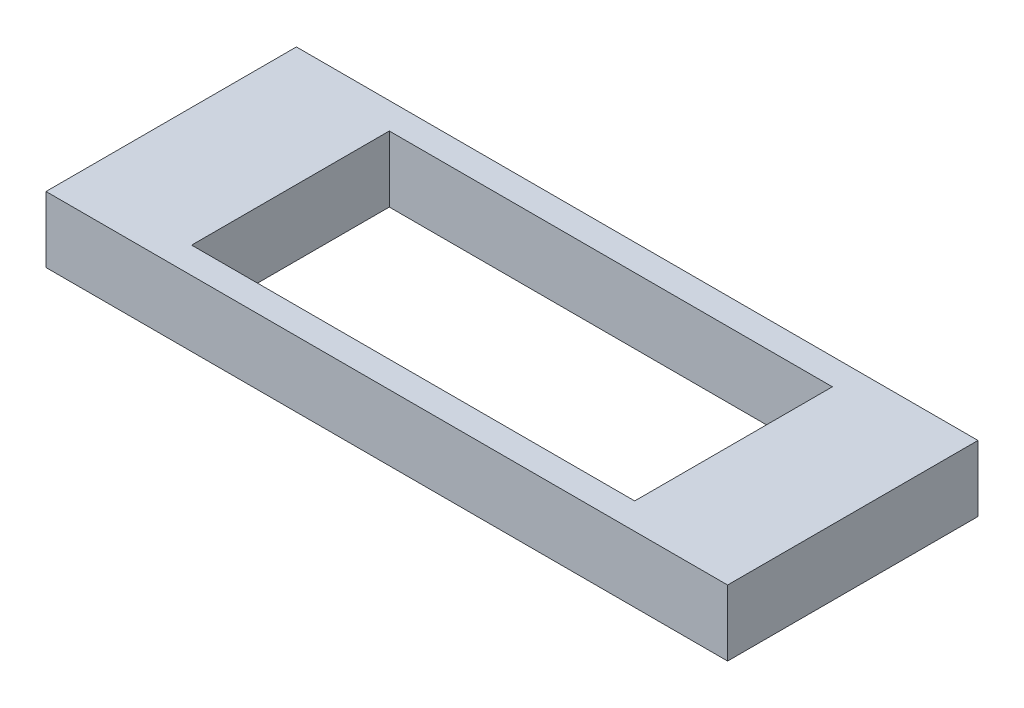
ISO-10303-21;
HEADER;
FILE_DESCRIPTION(('STEP AP214'),'2;1');
FILE_NAME('part.step','',(''),(''),'','','');
FILE_SCHEMA(('AUTOMOTIVE_DESIGN { 1 0 10303 214 1 1 1 1 }'));
ENDSEC;
DATA;
#1=APPLICATION_CONTEXT('core data for automotive mechanical design processes');
#2=APPLICATION_PROTOCOL_DEFINITION('international standard','automotive_design',2000,#1);
#3=PRODUCT_CONTEXT('',#1,'mechanical');
#4=PRODUCT('Part','Part','',(#3));
#5=PRODUCT_RELATED_PRODUCT_CATEGORY('part','',(#4));
#6=PRODUCT_DEFINITION_FORMATION('','',#4);
#7=PRODUCT_DEFINITION_CONTEXT('part definition',#1,'design');
#8=PRODUCT_DEFINITION('design','',#6,#7);
#9=PRODUCT_DEFINITION_SHAPE('','',#8);
#10=(LENGTH_UNIT() NAMED_UNIT(*) SI_UNIT(.MILLI.,.METRE.));
#11=(NAMED_UNIT(*) PLANE_ANGLE_UNIT() SI_UNIT($,.RADIAN.));
#12=(NAMED_UNIT(*) SI_UNIT($,.STERADIAN.) SOLID_ANGLE_UNIT());
#13=UNCERTAINTY_MEASURE_WITH_UNIT(LENGTH_MEASURE(1.E-05),#10,'distance_accuracy_value','');
#14=(GEOMETRIC_REPRESENTATION_CONTEXT(3) GLOBAL_UNCERTAINTY_ASSIGNED_CONTEXT((#13)) GLOBAL_UNIT_ASSIGNED_CONTEXT((#10,
#11,#12)) REPRESENTATION_CONTEXT('',''));
#15=CARTESIAN_POINT('',(0.,0.,0.));
#16=DIRECTION('',(0.,0.,1.));
#17=DIRECTION('',(1.,0.,0.));
#18=AXIS2_PLACEMENT_3D('',#15,#16,#17);
#19=CARTESIAN_POINT('',(-33.6217528353462,114.867131673616,5.));
#20=DIRECTION('',(-1.,0.,0.));
#21=DIRECTION('',(0.,0.,1.));
#22=AXIS2_PLACEMENT_3D('',#19,#20,#21);
#23=PLANE('',#22);
#24=DIRECTION('',(-6.86187218157383E-12,1.,0.));
#25=VECTOR('',#24,1.);
#26=CARTESIAN_POINT('',(-33.6217528354149,124.867131673616,35.));
#27=LINE('',#26,#25);
#28=CARTESIAN_POINT('',(-33.6217528353462,114.867131673616,35.));
#29=VERTEX_POINT('',#28);
#30=CARTESIAN_POINT('',(-33.6217528353462,124.867131673616,35.));
#31=VERTEX_POINT('',#30);
#32=EDGE_CURVE('E137',#29,#31,#27,.T.);
#33=ORIENTED_EDGE('',*,*,#32,.F.);
#34=DIRECTION('',(0.,0.,1.));
#35=VECTOR('',#34,1.);
#36=CARTESIAN_POINT('',(-33.6217528353462,114.867131673616,5.));
#37=LINE('',#36,#35);
#38=CARTESIAN_POINT('',(-33.6217528353462,114.867131673616,5.));
#39=VERTEX_POINT('',#38);
#40=EDGE_CURVE('E144',#39,#29,#37,.T.);
#41=ORIENTED_EDGE('',*,*,#40,.F.);
#42=DIRECTION('',(0.,1.,0.));
#43=VECTOR('',#42,1.);
#44=CARTESIAN_POINT('',(-33.6217528353462,114.867131673616,5.));
#45=LINE('',#44,#43);
#46=CARTESIAN_POINT('',(-33.6217528353462,124.867131673616,5.));
#47=VERTEX_POINT('',#46);
#48=EDGE_CURVE('E159',#39,#47,#45,.T.);
#49=ORIENTED_EDGE('',*,*,#48,.T.);
#50=DIRECTION('',(0.,0.,1.));
#51=VECTOR('',#50,1.);
#52=CARTESIAN_POINT('',(-33.6217528353462,124.867131673616,5.));
#53=LINE('',#52,#51);
#54=EDGE_CURVE('E143',#47,#31,#53,.T.);
#55=ORIENTED_EDGE('',*,*,#54,.T.);
#56=EDGE_LOOP('',(#33,#41,#49,#55));
#57=FACE_BOUND('',#56,.T.);
#58=ADVANCED_FACE('F43',(#57),#23,.F.);
#59=CARTESIAN_POINT('',(33.6217528353674,114.867131673616,5.));
#60=DIRECTION('',(1.,0.,0.));
#61=DIRECTION('',(0.,0.,-1.));
#62=AXIS2_PLACEMENT_3D('',#59,#60,#61);
#63=PLANE('',#62);
#64=DIRECTION('',(0.,-1.,0.));
#65=VECTOR('',#64,1.);
#66=CARTESIAN_POINT('',(33.6217528353674,114.867131673616,35.));
#67=LINE('',#66,#65);
#68=CARTESIAN_POINT('',(33.6217528353674,124.867131673616,35.));
#69=VERTEX_POINT('',#68);
#70=CARTESIAN_POINT('',(33.6217528353674,114.867131673616,35.));
#71=VERTEX_POINT('',#70);
#72=EDGE_CURVE('E131',#69,#71,#67,.T.);
#73=ORIENTED_EDGE('',*,*,#72,.F.);
#74=DIRECTION('',(0.,0.,-1.));
#75=VECTOR('',#74,1.);
#76=CARTESIAN_POINT('',(33.6217528353674,124.867131673616,5.));
#77=LINE('',#76,#75);
#78=CARTESIAN_POINT('',(33.6217528353674,124.867131673616,5.));
#79=VERTEX_POINT('',#78);
#80=EDGE_CURVE('E155',#69,#79,#77,.T.);
#81=ORIENTED_EDGE('',*,*,#80,.T.);
#82=DIRECTION('',(0.,1.,0.));
#83=VECTOR('',#82,1.);
#84=CARTESIAN_POINT('',(33.6217528353674,114.867131673616,5.));
#85=LINE('',#84,#83);
#86=CARTESIAN_POINT('',(33.6217528353674,114.867131673616,5.));
#87=VERTEX_POINT('',#86);
#88=EDGE_CURVE('E153',#87,#79,#85,.T.);
#89=ORIENTED_EDGE('',*,*,#88,.F.);
#90=DIRECTION('',(0.,0.,-1.));
#91=VECTOR('',#90,1.);
#92=CARTESIAN_POINT('',(33.6217528353674,114.867131673616,5.));
#93=LINE('',#92,#91);
#94=EDGE_CURVE('E147',#71,#87,#93,.T.);
#95=ORIENTED_EDGE('',*,*,#94,.F.);
#96=EDGE_LOOP('',(#73,#81,#89,#95));
#97=FACE_BOUND('',#96,.T.);
#98=ADVANCED_FACE('F189',(#97),#63,.F.);
#99=CARTESIAN_POINT('',(-51.7216594338497,114.867131673616,66.));
#100=DIRECTION('',(0.,1.,0.));
#101=DIRECTION('',(0.,0.,1.));
#102=AXIS2_PLACEMENT_3D('',#99,#100,#101);
#103=PLANE('',#102);
#104=DIRECTION('',(-1.,0.,0.));
#105=VECTOR('',#104,1.);
#106=CARTESIAN_POINT('',(-33.6217528353462,114.867131673616,35.));
#107=LINE('',#106,#105);
#108=EDGE_CURVE('E134',#71,#29,#107,.T.);
#109=ORIENTED_EDGE('',*,*,#108,.F.);
#110=ORIENTED_EDGE('',*,*,#94,.T.);
#111=DIRECTION('',(-1.,0.,0.));
#112=VECTOR('',#111,1.);
#113=CARTESIAN_POINT('',(-33.6217528353462,114.867131673616,5.));
#114=LINE('',#113,#112);
#115=EDGE_CURVE('E150',#87,#39,#114,.T.);
#116=ORIENTED_EDGE('',*,*,#115,.T.);
#117=ORIENTED_EDGE('',*,*,#40,.T.);
#118=EDGE_LOOP('',(#109,#110,#116,#117));
#119=FACE_BOUND('',#118,.T.);
#120=DIRECTION('',(0.,0.,-1.));
#121=VECTOR('',#120,1.);
#122=CARTESIAN_POINT('',(51.721659433847,114.867131673616,66.));
#123=LINE('',#122,#121);
#124=CARTESIAN_POINT('',(51.721659433847,114.867131673616,39.));
#125=VERTEX_POINT('',#124);
#126=CARTESIAN_POINT('',(51.721659433847,114.867131673616,1.));
#127=VERTEX_POINT('',#126);
#128=EDGE_CURVE('E11',#125,#127,#123,.T.);
#129=ORIENTED_EDGE('',*,*,#128,.F.);
#130=DIRECTION('',(-1.,0.,0.));
#131=VECTOR('',#130,1.);
#132=CARTESIAN_POINT('',(-51.7216594338497,114.867131673616,39.));
#133=LINE('',#132,#131);
#134=CARTESIAN_POINT('',(-51.7216594338497,114.867131673616,39.));
#135=VERTEX_POINT('',#134);
#136=EDGE_CURVE('E106',#125,#135,#133,.T.);
#137=ORIENTED_EDGE('',*,*,#136,.T.);
#138=DIRECTION('',(0.,0.,-1.));
#139=VECTOR('',#138,1.);
#140=CARTESIAN_POINT('',(-51.7216594338497,114.867131673616,66.));
#141=LINE('',#140,#139);
#142=CARTESIAN_POINT('',(-51.7216594338497,114.867131673616,1.));
#143=VERTEX_POINT('',#142);
#144=EDGE_CURVE('E122',#135,#143,#141,.T.);
#145=ORIENTED_EDGE('',*,*,#144,.T.);
#146=DIRECTION('',(1.,0.,0.));
#147=VECTOR('',#146,1.);
#148=CARTESIAN_POINT('',(-51.7216594338497,114.867131673616,1.));
#149=LINE('',#148,#147);
#150=EDGE_CURVE('E66',#143,#127,#149,.T.);
#151=ORIENTED_EDGE('',*,*,#150,.T.);
#152=EDGE_LOOP('',(#129,#137,#145,#151));
#153=FACE_BOUND('',#152,.T.);
#154=ADVANCED_FACE('F45',(#119,#153),#103,.F.);
#155=CARTESIAN_POINT('',(51.721659433847,124.867131673616,66.));
#156=DIRECTION('',(1.,0.,0.));
#157=DIRECTION('',(0.,0.,-1.));
#158=AXIS2_PLACEMENT_3D('',#155,#156,#157);
#159=PLANE('',#158);
#160=DIRECTION('',(0.,1.,0.));
#161=VECTOR('',#160,1.);
#162=CARTESIAN_POINT('',(51.721659433847,114.867131673616,39.));
#163=LINE('',#162,#161);
#164=CARTESIAN_POINT('',(51.721659433847,124.867131673616,39.));
#165=VERTEX_POINT('',#164);
#166=EDGE_CURVE('E109',#125,#165,#163,.T.);
#167=ORIENTED_EDGE('',*,*,#166,.F.);
#168=ORIENTED_EDGE('',*,*,#128,.T.);
#169=DIRECTION('',(0.,1.,0.));
#170=VECTOR('',#169,1.);
#171=CARTESIAN_POINT('',(51.721659433847,114.867131673616,1.));
#172=LINE('',#171,#170);
#173=CARTESIAN_POINT('',(51.721659433847,124.867131673616,1.));
#174=VERTEX_POINT('',#173);
#175=EDGE_CURVE('E127',#127,#174,#172,.T.);
#176=ORIENTED_EDGE('',*,*,#175,.T.);
#177=DIRECTION('',(0.,0.,-1.));
#178=VECTOR('',#177,1.);
#179=CARTESIAN_POINT('',(51.721659433847,124.867131673616,66.));
#180=LINE('',#179,#178);
#181=EDGE_CURVE('E51',#165,#174,#180,.T.);
#182=ORIENTED_EDGE('',*,*,#181,.F.);
#183=EDGE_LOOP('',(#167,#168,#176,#182));
#184=FACE_BOUND('',#183,.T.);
#185=ADVANCED_FACE('F118',(#184),#159,.T.);
#186=CARTESIAN_POINT('',(-51.7216594338497,124.867131673616,66.));
#187=DIRECTION('',(0.,1.,0.));
#188=DIRECTION('',(0.,0.,1.));
#189=AXIS2_PLACEMENT_3D('',#186,#187,#188);
#190=PLANE('',#189);
#191=DIRECTION('',(-1.,0.,0.));
#192=VECTOR('',#191,1.);
#193=CARTESIAN_POINT('',(-51.7216594338497,124.867131673616,39.));
#194=LINE('',#193,#192);
#195=CARTESIAN_POINT('',(-51.7216594338497,124.867131673616,39.));
#196=VERTEX_POINT('',#195);
#197=EDGE_CURVE('E58',#165,#196,#194,.T.);
#198=ORIENTED_EDGE('',*,*,#197,.F.);
#199=ORIENTED_EDGE('',*,*,#181,.T.);
#200=DIRECTION('',(1.,0.,0.));
#201=VECTOR('',#200,1.);
#202=CARTESIAN_POINT('',(-51.7216594338497,124.867131673616,1.));
#203=LINE('',#202,#201);
#204=CARTESIAN_POINT('',(-51.7216594338497,124.867131673616,1.));
#205=VERTEX_POINT('',#204);
#206=EDGE_CURVE('E123',#205,#174,#203,.T.);
#207=ORIENTED_EDGE('',*,*,#206,.F.);
#208=DIRECTION('',(0.,0.,-1.));
#209=VECTOR('',#208,1.);
#210=CARTESIAN_POINT('',(-51.7216594338497,124.867131673616,66.));
#211=LINE('',#210,#209);
#212=EDGE_CURVE('E164',#196,#205,#211,.T.);
#213=ORIENTED_EDGE('',*,*,#212,.F.);
#214=EDGE_LOOP('',(#198,#199,#207,#213));
#215=FACE_BOUND('',#214,.T.);
#216=ORIENTED_EDGE('',*,*,#80,.F.);
#217=DIRECTION('',(1.,0.,0.));
#218=VECTOR('',#217,1.);
#219=CARTESIAN_POINT('',(33.6217528353674,124.867131673616,35.));
#220=LINE('',#219,#218);
#221=EDGE_CURVE('E140',#31,#69,#220,.T.);
#222=ORIENTED_EDGE('',*,*,#221,.F.);
#223=ORIENTED_EDGE('',*,*,#54,.F.);
#224=DIRECTION('',(-1.,0.,0.));
#225=VECTOR('',#224,1.);
#226=CARTESIAN_POINT('',(-33.6217528353462,124.867131673616,5.));
#227=LINE('',#226,#225);
#228=EDGE_CURVE('E148',#79,#47,#227,.T.);
#229=ORIENTED_EDGE('',*,*,#228,.F.);
#230=EDGE_LOOP('',(#216,#222,#223,#229));
#231=FACE_BOUND('',#230,.T.);
#232=ADVANCED_FACE('F168',(#215,#231),#190,.T.);
#233=CARTESIAN_POINT('',(-51.7216594338497,114.867131673616,66.));
#234=DIRECTION('',(-1.,0.,0.));
#235=DIRECTION('',(0.,0.,1.));
#236=AXIS2_PLACEMENT_3D('',#233,#234,#235);
#237=PLANE('',#236);
#238=DIRECTION('',(0.,1.,0.));
#239=VECTOR('',#238,1.);
#240=CARTESIAN_POINT('',(-51.7216594338497,114.867131673616,39.));
#241=LINE('',#240,#239);
#242=EDGE_CURVE('E110',#135,#196,#241,.T.);
#243=ORIENTED_EDGE('',*,*,#242,.T.);
#244=ORIENTED_EDGE('',*,*,#212,.T.);
#245=DIRECTION('',(0.,1.,0.));
#246=VECTOR('',#245,1.);
#247=CARTESIAN_POINT('',(-51.7216594338497,114.867131673616,1.));
#248=LINE('',#247,#246);
#249=EDGE_CURVE('E124',#143,#205,#248,.T.);
#250=ORIENTED_EDGE('',*,*,#249,.F.);
#251=ORIENTED_EDGE('',*,*,#144,.F.);
#252=EDGE_LOOP('',(#243,#244,#250,#251));
#253=FACE_BOUND('',#252,.T.);
#254=ADVANCED_FACE('F175',(#253),#237,.T.);
#255=CARTESIAN_POINT('',(-33.6217528353462,114.867131673616,5.));
#256=DIRECTION('',(0.,0.,-1.));
#257=DIRECTION('',(-1.,0.,0.));
#258=AXIS2_PLACEMENT_3D('',#255,#256,#257);
#259=PLANE('',#258);
#260=ORIENTED_EDGE('',*,*,#228,.T.);
#261=ORIENTED_EDGE('',*,*,#48,.F.);
#262=ORIENTED_EDGE('',*,*,#115,.F.);
#263=ORIENTED_EDGE('',*,*,#88,.T.);
#264=EDGE_LOOP('',(#260,#261,#262,#263));
#265=FACE_BOUND('',#264,.T.);
#266=ADVANCED_FACE('F177',(#265),#259,.F.);
#267=CARTESIAN_POINT('',(0.,0.,35.));
#268=DIRECTION('',(0.,0.,1.));
#269=DIRECTION('',(1.,0.,0.));
#270=AXIS2_PLACEMENT_3D('',#267,#268,#269);
#271=PLANE('',#270);
#272=ORIENTED_EDGE('',*,*,#72,.T.);
#273=ORIENTED_EDGE('',*,*,#108,.T.);
#274=ORIENTED_EDGE('',*,*,#32,.T.);
#275=ORIENTED_EDGE('',*,*,#221,.T.);
#276=EDGE_LOOP('',(#272,#273,#274,#275));
#277=FACE_BOUND('',#276,.T.);
#278=ADVANCED_FACE('F183',(#277),#271,.F.);
#279=CARTESIAN_POINT('',(-51.7216594338497,114.867131673616,1.));
#280=DIRECTION('',(0.,0.,1.));
#281=DIRECTION('',(1.,0.,0.));
#282=AXIS2_PLACEMENT_3D('',#279,#280,#281);
#283=PLANE('',#282);
#284=ORIENTED_EDGE('',*,*,#206,.T.);
#285=ORIENTED_EDGE('',*,*,#175,.F.);
#286=ORIENTED_EDGE('',*,*,#150,.F.);
#287=ORIENTED_EDGE('',*,*,#249,.T.);
#288=EDGE_LOOP('',(#284,#285,#286,#287));
#289=FACE_BOUND('',#288,.T.);
#290=ADVANCED_FACE('F173',(#289),#283,.F.);
#291=CARTESIAN_POINT('',(-51.7216594338497,114.867131673616,39.));
#292=DIRECTION('',(0.,0.,-1.));
#293=DIRECTION('',(-1.,0.,0.));
#294=AXIS2_PLACEMENT_3D('',#291,#292,#293);
#295=PLANE('',#294);
#296=ORIENTED_EDGE('',*,*,#197,.T.);
#297=ORIENTED_EDGE('',*,*,#242,.F.);
#298=ORIENTED_EDGE('',*,*,#136,.F.);
#299=ORIENTED_EDGE('',*,*,#166,.T.);
#300=EDGE_LOOP('',(#296,#297,#298,#299));
#301=FACE_BOUND('',#300,.T.);
#302=ADVANCED_FACE('F108',(#301),#295,.F.);
#303=CLOSED_SHELL('',(#58,#98,#154,#185,#232,#254,#266,#278,#290,#302));
#304=MANIFOLD_SOLID_BREP('B2',#303);
#305=ADVANCED_BREP_SHAPE_REPRESENTATION('',(#18,#304),#14);
#306=SHAPE_DEFINITION_REPRESENTATION(#9,#305);
ENDSEC;
END-ISO-10303-21;
